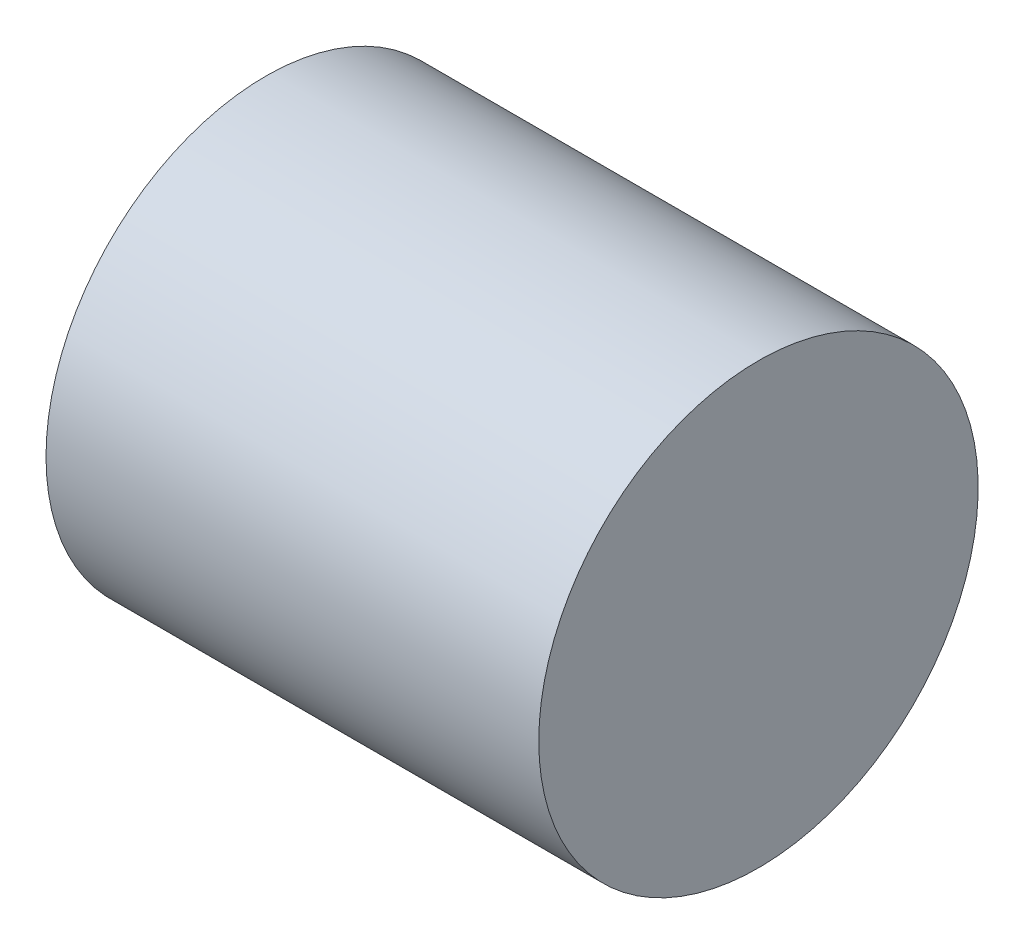
ISO-10303-21;
HEADER;
FILE_DESCRIPTION(('STEP AP214'),'2;1');
FILE_NAME('part.step','',(''),(''),'','','');
FILE_SCHEMA(('AUTOMOTIVE_DESIGN { 1 0 10303 214 1 1 1 1 }'));
ENDSEC;
DATA;
#1=APPLICATION_CONTEXT('core data for automotive mechanical design processes');
#2=APPLICATION_PROTOCOL_DEFINITION('international standard','automotive_design',2000,#1);
#3=PRODUCT_CONTEXT('',#1,'mechanical');
#4=PRODUCT('Part','Part','',(#3));
#5=PRODUCT_RELATED_PRODUCT_CATEGORY('part','',(#4));
#6=PRODUCT_DEFINITION_FORMATION('','',#4);
#7=PRODUCT_DEFINITION_CONTEXT('part definition',#1,'design');
#8=PRODUCT_DEFINITION('design','',#6,#7);
#9=PRODUCT_DEFINITION_SHAPE('','',#8);
#10=(LENGTH_UNIT() NAMED_UNIT(*) SI_UNIT(.MILLI.,.METRE.));
#11=(NAMED_UNIT(*) PLANE_ANGLE_UNIT() SI_UNIT($,.RADIAN.));
#12=(NAMED_UNIT(*) SI_UNIT($,.STERADIAN.) SOLID_ANGLE_UNIT());
#13=UNCERTAINTY_MEASURE_WITH_UNIT(LENGTH_MEASURE(1.E-05),#10,'distance_accuracy_value','');
#14=(GEOMETRIC_REPRESENTATION_CONTEXT(3) GLOBAL_UNCERTAINTY_ASSIGNED_CONTEXT((#13)) GLOBAL_UNIT_ASSIGNED_CONTEXT((#10,
#11,#12)) REPRESENTATION_CONTEXT('',''));
#15=CARTESIAN_POINT('',(0.,0.,0.));
#16=DIRECTION('',(0.,0.,1.));
#17=DIRECTION('',(1.,0.,0.));
#18=AXIS2_PLACEMENT_3D('',#15,#16,#17);
#19=CARTESIAN_POINT('',(-1200.,535.,0.));
#20=DIRECTION('',(1.,0.,0.));
#21=DIRECTION('',(0.,0.,-1.));
#22=AXIS2_PLACEMENT_3D('',#19,#20,#21);
#23=PLANE('',#22);
#24=CARTESIAN_POINT('',(-1200.,0.,0.));
#25=DIRECTION('',(1.,0.,0.));
#26=DIRECTION('',(0.,0.,-1.));
#27=AXIS2_PLACEMENT_3D('',#24,#25,#26);
#28=CIRCLE('',#27,485.);
#29=CARTESIAN_POINT('',(-1200.,0.,-485.));
#30=VERTEX_POINT('',#29);
#31=EDGE_CURVE('E54',#30,#30,#28,.F.);
#32=ORIENTED_EDGE('',*,*,#31,.F.);
#33=EDGE_LOOP('',(#32));
#34=FACE_BOUND('',#33,.T.);
#35=CARTESIAN_POINT('',(-1200.,0.,0.));
#36=DIRECTION('',(-1.,0.,0.));
#37=DIRECTION('',(0.,0.,1.));
#38=AXIS2_PLACEMENT_3D('',#35,#36,#37);
#39=CIRCLE('',#38,535.);
#40=CARTESIAN_POINT('',(-1200.,0.,535.));
#41=VERTEX_POINT('',#40);
#42=EDGE_CURVE('E46',#41,#41,#39,.T.);
#43=ORIENTED_EDGE('',*,*,#42,.T.);
#44=EDGE_LOOP('',(#43));
#45=FACE_BOUND('',#44,.T.);
#46=ADVANCED_FACE('F40',(#34,#45),#23,.F.);
#47=CARTESIAN_POINT('',(0.,0.,0.));
#48=DIRECTION('',(-1.,0.,0.));
#49=DIRECTION('',(0.,0.,1.));
#50=AXIS2_PLACEMENT_3D('',#47,#48,#49);
#51=PLANE('',#50);
#52=CARTESIAN_POINT('',(-1.28369537222284E-13,0.,0.));
#53=DIRECTION('',(-1.,0.,0.));
#54=DIRECTION('',(0.,0.,1.));
#55=AXIS2_PLACEMENT_3D('',#52,#53,#54);
#56=CIRCLE('',#55,535.);
#57=CARTESIAN_POINT('',(-1.28369537222284E-13,0.,535.));
#58=VERTEX_POINT('',#57);
#59=EDGE_CURVE('E10',#58,#58,#56,.T.);
#60=ORIENTED_EDGE('',*,*,#59,.F.);
#61=EDGE_LOOP('',(#60));
#62=FACE_BOUND('',#61,.T.);
#63=ADVANCED_FACE('F64',(#62),#51,.F.);
#64=CARTESIAN_POINT('',(-22.711120792057,0.,0.));
#65=DIRECTION('',(-1.,0.,0.));
#66=DIRECTION('',(0.,0.,1.));
#67=AXIS2_PLACEMENT_3D('',#64,#65,#66);
#68=CYLINDRICAL_SURFACE('',#67,535.);
#69=ORIENTED_EDGE('',*,*,#42,.F.);
#70=EDGE_LOOP('',(#69));
#71=FACE_BOUND('',#70,.T.);
#72=ORIENTED_EDGE('',*,*,#59,.T.);
#73=EDGE_LOOP('',(#72));
#74=FACE_BOUND('',#73,.T.);
#75=ADVANCED_FACE('F70',(#71,#74),#68,.T.);
#76=CARTESIAN_POINT('',(-50.0000000000001,0.,0.));
#77=DIRECTION('',(-1.,0.,0.));
#78=DIRECTION('',(0.,0.,1.));
#79=AXIS2_PLACEMENT_3D('',#76,#77,#78);
#80=PLANE('',#79);
#81=CARTESIAN_POINT('',(-50.0000000000001,0.,0.));
#82=DIRECTION('',(-1.,0.,0.));
#83=DIRECTION('',(0.,0.,1.));
#84=AXIS2_PLACEMENT_3D('',#81,#82,#83);
#85=CIRCLE('',#84,485.);
#86=CARTESIAN_POINT('',(-50.0000000000001,0.,485.));
#87=VERTEX_POINT('',#86);
#88=EDGE_CURVE('E50',#87,#87,#85,.T.);
#89=ORIENTED_EDGE('',*,*,#88,.T.);
#90=EDGE_LOOP('',(#89));
#91=FACE_BOUND('',#90,.T.);
#92=ADVANCED_FACE('F74',(#91),#80,.T.);
#93=CARTESIAN_POINT('',(-22.711120792057,0.,0.));
#94=DIRECTION('',(-1.,0.,0.));
#95=DIRECTION('',(0.,0.,1.));
#96=AXIS2_PLACEMENT_3D('',#93,#94,#95);
#97=CYLINDRICAL_SURFACE('',#96,485.);
#98=ORIENTED_EDGE('',*,*,#31,.T.);
#99=EDGE_LOOP('',(#98));
#100=FACE_BOUND('',#99,.T.);
#101=ORIENTED_EDGE('',*,*,#88,.F.);
#102=EDGE_LOOP('',(#101));
#103=FACE_BOUND('',#102,.T.);
#104=ADVANCED_FACE('F60',(#100,#103),#97,.F.);
#105=CLOSED_SHELL('',(#46,#63,#75,#92,#104));
#106=MANIFOLD_SOLID_BREP('B2',#105);
#107=ADVANCED_BREP_SHAPE_REPRESENTATION('',(#18,#106),#14);
#108=SHAPE_DEFINITION_REPRESENTATION(#9,#107);
ENDSEC;
END-ISO-10303-21;
